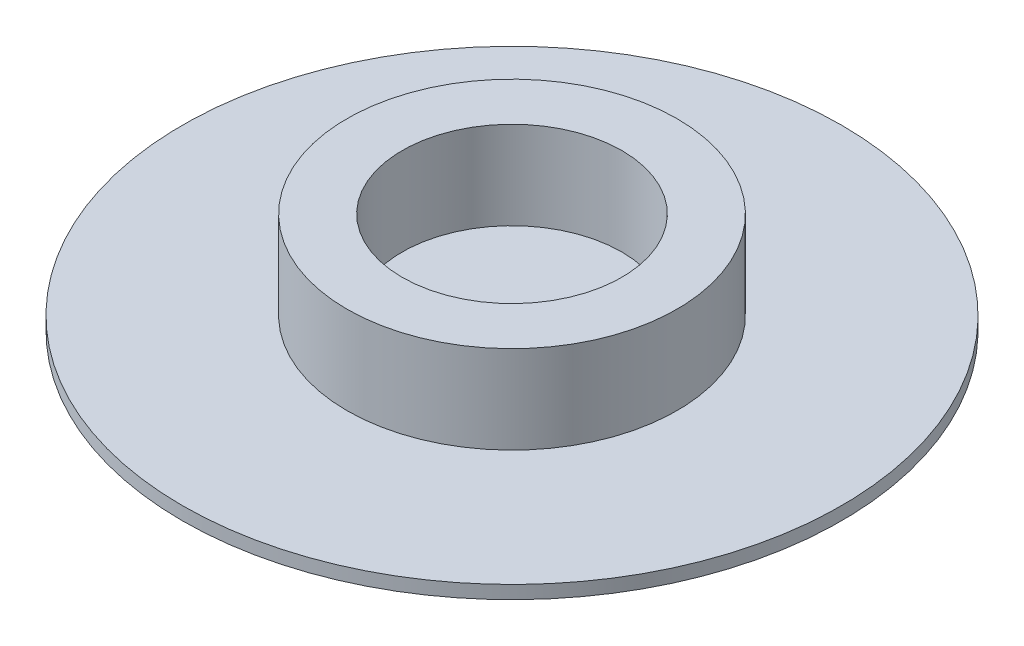
ISO-10303-21;
HEADER;
FILE_DESCRIPTION(('STEP AP214'),'2;1');
FILE_NAME('part.step','',(''),(''),'','','');
FILE_SCHEMA(('AUTOMOTIVE_DESIGN { 1 0 10303 214 1 1 1 1 }'));
ENDSEC;
DATA;
#1=APPLICATION_CONTEXT('core data for automotive mechanical design processes');
#2=APPLICATION_PROTOCOL_DEFINITION('international standard','automotive_design',2000,#1);
#3=PRODUCT_CONTEXT('',#1,'mechanical');
#4=PRODUCT('Part','Part','',(#3));
#5=PRODUCT_RELATED_PRODUCT_CATEGORY('part','',(#4));
#6=PRODUCT_DEFINITION_FORMATION('','',#4);
#7=PRODUCT_DEFINITION_CONTEXT('part definition',#1,'design');
#8=PRODUCT_DEFINITION('design','',#6,#7);
#9=PRODUCT_DEFINITION_SHAPE('','',#8);
#10=(LENGTH_UNIT() NAMED_UNIT(*) SI_UNIT(.MILLI.,.METRE.));
#11=(NAMED_UNIT(*) PLANE_ANGLE_UNIT() SI_UNIT($,.RADIAN.));
#12=(NAMED_UNIT(*) SI_UNIT($,.STERADIAN.) SOLID_ANGLE_UNIT());
#13=UNCERTAINTY_MEASURE_WITH_UNIT(LENGTH_MEASURE(1.E-05),#10,'distance_accuracy_value','');
#14=(GEOMETRIC_REPRESENTATION_CONTEXT(3) GLOBAL_UNCERTAINTY_ASSIGNED_CONTEXT((#13)) GLOBAL_UNIT_ASSIGNED_CONTEXT((#10,
#11,#12)) REPRESENTATION_CONTEXT('',''));
#15=CARTESIAN_POINT('',(0.,0.,0.));
#16=DIRECTION('',(0.,0.,1.));
#17=DIRECTION('',(1.,0.,0.));
#18=AXIS2_PLACEMENT_3D('',#15,#16,#17);
#19=CARTESIAN_POINT('',(0.,3.,0.));
#20=DIRECTION('',(0.,-1.,0.));
#21=DIRECTION('',(0.,0.,-1.));
#22=AXIS2_PLACEMENT_3D('',#19,#20,#21);
#23=CYLINDRICAL_SURFACE('',#22,75.);
#24=CARTESIAN_POINT('',(0.,3.,0.));
#25=DIRECTION('',(0.,1.,0.));
#26=DIRECTION('',(0.,0.,1.));
#27=AXIS2_PLACEMENT_3D('',#24,#25,#26);
#28=CIRCLE('',#27,75.);
#29=CARTESIAN_POINT('',(0.,3.,75.));
#30=VERTEX_POINT('',#29);
#31=EDGE_CURVE('E51',#30,#30,#28,.T.);
#32=ORIENTED_EDGE('',*,*,#31,.F.);
#33=EDGE_LOOP('',(#32));
#34=FACE_BOUND('',#33,.T.);
#35=CARTESIAN_POINT('',(0.,0.,0.));
#36=DIRECTION('',(0.,1.,0.));
#37=DIRECTION('',(0.,0.,1.));
#38=AXIS2_PLACEMENT_3D('',#35,#36,#37);
#39=CIRCLE('',#38,75.);
#40=CARTESIAN_POINT('',(0.,0.,75.));
#41=VERTEX_POINT('',#40);
#42=EDGE_CURVE('E156',#41,#41,#39,.T.);
#43=ORIENTED_EDGE('',*,*,#42,.T.);
#44=EDGE_LOOP('',(#43));
#45=FACE_BOUND('',#44,.T.);
#46=ADVANCED_FACE('F43',(#34,#45),#23,.T.);
#47=CARTESIAN_POINT('',(0.,3.,0.));
#48=DIRECTION('',(0.,1.,0.));
#49=DIRECTION('',(0.,0.,1.));
#50=AXIS2_PLACEMENT_3D('',#47,#48,#49);
#51=PLANE('',#50);
#52=CARTESIAN_POINT('',(0.,3.,0.));
#53=DIRECTION('',(0.,1.,0.));
#54=DIRECTION('',(0.,0.,1.));
#55=AXIS2_PLACEMENT_3D('',#52,#53,#54);
#56=CIRCLE('',#55,37.559343170997);
#57=CARTESIAN_POINT('',(0.,3.,37.559343170997));
#58=VERTEX_POINT('',#57);
#59=EDGE_CURVE('E138',#58,#58,#56,.T.);
#60=ORIENTED_EDGE('',*,*,#59,.F.);
#61=EDGE_LOOP('',(#60));
#62=FACE_BOUND('',#61,.T.);
#63=ORIENTED_EDGE('',*,*,#31,.T.);
#64=EDGE_LOOP('',(#63));
#65=FACE_BOUND('',#64,.T.);
#66=ADVANCED_FACE('F215',(#62,#65),#51,.T.);
#67=CARTESIAN_POINT('',(0.,0.,0.));
#68=DIRECTION('',(0.,1.,0.));
#69=DIRECTION('',(0.,0.,1.));
#70=AXIS2_PLACEMENT_3D('',#67,#68,#69);
#71=PLANE('',#70);
#72=DIRECTION('',(-1.,0.,0.));
#73=VECTOR('',#72,1.);
#74=CARTESIAN_POINT('',(-47.5,0.,25.));
#75=LINE('',#74,#73);
#76=CARTESIAN_POINT('',(-32.5,0.,25.));
#77=VERTEX_POINT('',#76);
#78=CARTESIAN_POINT('',(-47.5,0.,25.));
#79=VERTEX_POINT('',#78);
#80=EDGE_CURVE('E147',#77,#79,#75,.T.);
#81=ORIENTED_EDGE('',*,*,#80,.F.);
#82=DIRECTION('',(0.,0.,1.));
#83=VECTOR('',#82,1.);
#84=CARTESIAN_POINT('',(-32.5,0.,-25.));
#85=LINE('',#84,#83);
#86=CARTESIAN_POINT('',(-32.5,0.,-25.));
#87=VERTEX_POINT('',#86);
#88=EDGE_CURVE('E58',#87,#77,#85,.T.);
#89=ORIENTED_EDGE('',*,*,#88,.F.);
#90=DIRECTION('',(1.,0.,0.));
#91=VECTOR('',#90,1.);
#92=CARTESIAN_POINT('',(-47.5,0.,-25.));
#93=LINE('',#92,#91);
#94=CARTESIAN_POINT('',(-47.5,0.,-25.));
#95=VERTEX_POINT('',#94);
#96=EDGE_CURVE('E131',#95,#87,#93,.T.);
#97=ORIENTED_EDGE('',*,*,#96,.F.);
#98=DIRECTION('',(0.,0.,-1.));
#99=VECTOR('',#98,1.);
#100=CARTESIAN_POINT('',(-47.5,0.,-25.));
#101=LINE('',#100,#99);
#102=EDGE_CURVE('E135',#79,#95,#101,.T.);
#103=ORIENTED_EDGE('',*,*,#102,.F.);
#104=EDGE_LOOP('',(#81,#89,#97,#103));
#105=FACE_BOUND('',#104,.T.);
#106=DIRECTION('',(-1.,0.,0.));
#107=VECTOR('',#106,1.);
#108=CARTESIAN_POINT('',(47.5,0.,25.));
#109=LINE('',#108,#107);
#110=CARTESIAN_POINT('',(47.5,0.,25.));
#111=VERTEX_POINT('',#110);
#112=CARTESIAN_POINT('',(32.5,0.,25.));
#113=VERTEX_POINT('',#112);
#114=EDGE_CURVE('E185',#111,#113,#109,.T.);
#115=ORIENTED_EDGE('',*,*,#114,.F.);
#116=DIRECTION('',(0.,0.,1.));
#117=VECTOR('',#116,1.);
#118=CARTESIAN_POINT('',(47.5,0.,-25.));
#119=LINE('',#118,#117);
#120=CARTESIAN_POINT('',(47.5,0.,-25.));
#121=VERTEX_POINT('',#120);
#122=EDGE_CURVE('E66',#121,#111,#119,.T.);
#123=ORIENTED_EDGE('',*,*,#122,.F.);
#124=DIRECTION('',(1.,0.,0.));
#125=VECTOR('',#124,1.);
#126=CARTESIAN_POINT('',(47.5,0.,-25.));
#127=LINE('',#126,#125);
#128=CARTESIAN_POINT('',(32.5,0.,-25.));
#129=VERTEX_POINT('',#128);
#130=EDGE_CURVE('E176',#129,#121,#127,.T.);
#131=ORIENTED_EDGE('',*,*,#130,.F.);
#132=DIRECTION('',(0.,0.,-1.));
#133=VECTOR('',#132,1.);
#134=CARTESIAN_POINT('',(32.5,0.,-25.));
#135=LINE('',#134,#133);
#136=EDGE_CURVE('E180',#113,#129,#135,.T.);
#137=ORIENTED_EDGE('',*,*,#136,.F.);
#138=EDGE_LOOP('',(#115,#123,#131,#137));
#139=FACE_BOUND('',#138,.T.);
#140=ORIENTED_EDGE('',*,*,#42,.F.);
#141=EDGE_LOOP('',(#140));
#142=FACE_BOUND('',#141,.T.);
#143=ADVANCED_FACE('F212',(#105,#139,#142),#71,.F.);
#144=CARTESIAN_POINT('',(47.5,1.,-25.));
#145=DIRECTION('',(1.,0.,0.));
#146=DIRECTION('',(0.,0.,-1.));
#147=AXIS2_PLACEMENT_3D('',#144,#145,#146);
#148=PLANE('',#147);
#149=ORIENTED_EDGE('',*,*,#122,.T.);
#150=DIRECTION('',(0.,-1.,0.));
#151=VECTOR('',#150,1.);
#152=CARTESIAN_POINT('',(47.5,1.,25.));
#153=LINE('',#152,#151);
#154=CARTESIAN_POINT('',(47.5,1.,25.));
#155=VERTEX_POINT('',#154);
#156=EDGE_CURVE('E162',#155,#111,#153,.T.);
#157=ORIENTED_EDGE('',*,*,#156,.F.);
#158=DIRECTION('',(0.,0.,1.));
#159=VECTOR('',#158,1.);
#160=CARTESIAN_POINT('',(47.5,1.,-25.));
#161=LINE('',#160,#159);
#162=CARTESIAN_POINT('',(47.5,1.,-25.));
#163=VERTEX_POINT('',#162);
#164=EDGE_CURVE('E181',#163,#155,#161,.T.);
#165=ORIENTED_EDGE('',*,*,#164,.F.);
#166=DIRECTION('',(0.,-1.,0.));
#167=VECTOR('',#166,1.);
#168=CARTESIAN_POINT('',(47.5,1.,-25.));
#169=LINE('',#168,#167);
#170=EDGE_CURVE('E172',#163,#121,#169,.T.);
#171=ORIENTED_EDGE('',*,*,#170,.T.);
#172=EDGE_LOOP('',(#149,#157,#165,#171));
#173=FACE_BOUND('',#172,.T.);
#174=ADVANCED_FACE('F214',(#173),#148,.F.);
#175=CARTESIAN_POINT('',(47.5,1.,-25.));
#176=DIRECTION('',(0.,0.,-1.));
#177=DIRECTION('',(-1.,0.,0.));
#178=AXIS2_PLACEMENT_3D('',#175,#176,#177);
#179=PLANE('',#178);
#180=ORIENTED_EDGE('',*,*,#130,.T.);
#181=ORIENTED_EDGE('',*,*,#170,.F.);
#182=DIRECTION('',(1.,0.,0.));
#183=VECTOR('',#182,1.);
#184=CARTESIAN_POINT('',(47.5,1.,-25.));
#185=LINE('',#184,#183);
#186=CARTESIAN_POINT('',(32.5,1.,-25.));
#187=VERTEX_POINT('',#186);
#188=EDGE_CURVE('E165',#187,#163,#185,.T.);
#189=ORIENTED_EDGE('',*,*,#188,.F.);
#190=DIRECTION('',(0.,-1.,0.));
#191=VECTOR('',#190,1.);
#192=CARTESIAN_POINT('',(32.5,1.,-25.));
#193=LINE('',#192,#191);
#194=EDGE_CURVE('E169',#187,#129,#193,.T.);
#195=ORIENTED_EDGE('',*,*,#194,.T.);
#196=EDGE_LOOP('',(#180,#181,#189,#195));
#197=FACE_BOUND('',#196,.T.);
#198=ADVANCED_FACE('F221',(#197),#179,.F.);
#199=CARTESIAN_POINT('',(32.5,1.,-25.));
#200=DIRECTION('',(-1.,0.,0.));
#201=DIRECTION('',(0.,0.,1.));
#202=AXIS2_PLACEMENT_3D('',#199,#200,#201);
#203=PLANE('',#202);
#204=ORIENTED_EDGE('',*,*,#136,.T.);
#205=ORIENTED_EDGE('',*,*,#194,.F.);
#206=DIRECTION('',(0.,0.,-1.));
#207=VECTOR('',#206,1.);
#208=CARTESIAN_POINT('',(32.5,1.,-25.));
#209=LINE('',#208,#207);
#210=CARTESIAN_POINT('',(32.5,1.,25.));
#211=VERTEX_POINT('',#210);
#212=EDGE_CURVE('E194',#211,#187,#209,.T.);
#213=ORIENTED_EDGE('',*,*,#212,.F.);
#214=DIRECTION('',(0.,-1.,0.));
#215=VECTOR('',#214,1.);
#216=CARTESIAN_POINT('',(32.5,1.,25.));
#217=LINE('',#216,#215);
#218=EDGE_CURVE('E166',#211,#113,#217,.T.);
#219=ORIENTED_EDGE('',*,*,#218,.T.);
#220=EDGE_LOOP('',(#204,#205,#213,#219));
#221=FACE_BOUND('',#220,.T.);
#222=ADVANCED_FACE('F350',(#221),#203,.F.);
#223=CARTESIAN_POINT('',(47.5,1.,25.));
#224=DIRECTION('',(0.,0.,1.));
#225=DIRECTION('',(1.,0.,0.));
#226=AXIS2_PLACEMENT_3D('',#223,#224,#225);
#227=PLANE('',#226);
#228=ORIENTED_EDGE('',*,*,#114,.T.);
#229=ORIENTED_EDGE('',*,*,#218,.F.);
#230=DIRECTION('',(-1.,0.,0.));
#231=VECTOR('',#230,1.);
#232=CARTESIAN_POINT('',(47.5,1.,25.));
#233=LINE('',#232,#231);
#234=EDGE_CURVE('E198',#155,#211,#233,.T.);
#235=ORIENTED_EDGE('',*,*,#234,.F.);
#236=ORIENTED_EDGE('',*,*,#156,.T.);
#237=EDGE_LOOP('',(#228,#229,#235,#236));
#238=FACE_BOUND('',#237,.T.);
#239=ADVANCED_FACE('F340',(#238),#227,.F.);
#240=CARTESIAN_POINT('',(0.,1.,0.));
#241=DIRECTION('',(0.,-1.,0.));
#242=DIRECTION('',(0.,0.,-1.));
#243=AXIS2_PLACEMENT_3D('',#240,#241,#242);
#244=PLANE('',#243);
#245=ORIENTED_EDGE('',*,*,#164,.T.);
#246=ORIENTED_EDGE('',*,*,#234,.T.);
#247=ORIENTED_EDGE('',*,*,#212,.T.);
#248=ORIENTED_EDGE('',*,*,#188,.T.);
#249=EDGE_LOOP('',(#245,#246,#247,#248));
#250=FACE_BOUND('',#249,.T.);
#251=ADVANCED_FACE('F331',(#250),#244,.T.);
#252=CARTESIAN_POINT('',(-32.5,1.,-25.));
#253=DIRECTION('',(1.,0.,0.));
#254=DIRECTION('',(0.,0.,-1.));
#255=AXIS2_PLACEMENT_3D('',#252,#253,#254);
#256=PLANE('',#255);
#257=ORIENTED_EDGE('',*,*,#88,.T.);
#258=DIRECTION('',(0.,-1.,0.));
#259=VECTOR('',#258,1.);
#260=CARTESIAN_POINT('',(-32.5,1.,25.));
#261=LINE('',#260,#259);
#262=CARTESIAN_POINT('',(-32.5,1.,25.));
#263=VERTEX_POINT('',#262);
#264=EDGE_CURVE('E106',#263,#77,#261,.T.);
#265=ORIENTED_EDGE('',*,*,#264,.F.);
#266=DIRECTION('',(0.,0.,1.));
#267=VECTOR('',#266,1.);
#268=CARTESIAN_POINT('',(-32.5,1.,-25.));
#269=LINE('',#268,#267);
#270=CARTESIAN_POINT('',(-32.5,1.,-25.));
#271=VERTEX_POINT('',#270);
#272=EDGE_CURVE('E110',#271,#263,#269,.T.);
#273=ORIENTED_EDGE('',*,*,#272,.F.);
#274=DIRECTION('',(0.,-1.,0.));
#275=VECTOR('',#274,1.);
#276=CARTESIAN_POINT('',(-32.5,1.,-25.));
#277=LINE('',#276,#275);
#278=EDGE_CURVE('E153',#271,#87,#277,.T.);
#279=ORIENTED_EDGE('',*,*,#278,.T.);
#280=EDGE_LOOP('',(#257,#265,#273,#279));
#281=FACE_BOUND('',#280,.T.);
#282=ADVANCED_FACE('F108',(#281),#256,.F.);
#283=CARTESIAN_POINT('',(-47.5,1.,-25.));
#284=DIRECTION('',(0.,0.,-1.));
#285=DIRECTION('',(-1.,0.,0.));
#286=AXIS2_PLACEMENT_3D('',#283,#284,#285);
#287=PLANE('',#286);
#288=ORIENTED_EDGE('',*,*,#96,.T.);
#289=ORIENTED_EDGE('',*,*,#278,.F.);
#290=DIRECTION('',(1.,0.,0.));
#291=VECTOR('',#290,1.);
#292=CARTESIAN_POINT('',(-47.5,1.,-25.));
#293=LINE('',#292,#291);
#294=CARTESIAN_POINT('',(-47.5,1.,-25.));
#295=VERTEX_POINT('',#294);
#296=EDGE_CURVE('E117',#295,#271,#293,.T.);
#297=ORIENTED_EDGE('',*,*,#296,.F.);
#298=DIRECTION('',(0.,-1.,0.));
#299=VECTOR('',#298,1.);
#300=CARTESIAN_POINT('',(-47.5,1.,-25.));
#301=LINE('',#300,#299);
#302=EDGE_CURVE('E157',#295,#95,#301,.T.);
#303=ORIENTED_EDGE('',*,*,#302,.T.);
#304=EDGE_LOOP('',(#288,#289,#297,#303));
#305=FACE_BOUND('',#304,.T.);
#306=ADVANCED_FACE('F312',(#305),#287,.F.);
#307=CARTESIAN_POINT('',(-47.5,1.,-25.));
#308=DIRECTION('',(-1.,0.,0.));
#309=DIRECTION('',(0.,0.,1.));
#310=AXIS2_PLACEMENT_3D('',#307,#308,#309);
#311=PLANE('',#310);
#312=ORIENTED_EDGE('',*,*,#102,.T.);
#313=ORIENTED_EDGE('',*,*,#302,.F.);
#314=DIRECTION('',(0.,0.,-1.));
#315=VECTOR('',#314,1.);
#316=CARTESIAN_POINT('',(-47.5,1.,-25.));
#317=LINE('',#316,#315);
#318=CARTESIAN_POINT('',(-47.5,1.,25.));
#319=VERTEX_POINT('',#318);
#320=EDGE_CURVE('E126',#319,#295,#317,.T.);
#321=ORIENTED_EDGE('',*,*,#320,.F.);
#322=DIRECTION('',(0.,-1.,0.));
#323=VECTOR('',#322,1.);
#324=CARTESIAN_POINT('',(-47.5,1.,25.));
#325=LINE('',#324,#323);
#326=EDGE_CURVE('E116',#319,#79,#325,.T.);
#327=ORIENTED_EDGE('',*,*,#326,.T.);
#328=EDGE_LOOP('',(#312,#313,#321,#327));
#329=FACE_BOUND('',#328,.T.);
#330=ADVANCED_FACE('F304',(#329),#311,.F.);
#331=CARTESIAN_POINT('',(-47.5,1.,25.));
#332=DIRECTION('',(0.,0.,1.));
#333=DIRECTION('',(1.,0.,0.));
#334=AXIS2_PLACEMENT_3D('',#331,#332,#333);
#335=PLANE('',#334);
#336=ORIENTED_EDGE('',*,*,#80,.T.);
#337=ORIENTED_EDGE('',*,*,#326,.F.);
#338=DIRECTION('',(-1.,0.,0.));
#339=VECTOR('',#338,1.);
#340=CARTESIAN_POINT('',(-47.5,1.,25.));
#341=LINE('',#340,#339);
#342=EDGE_CURVE('E120',#263,#319,#341,.T.);
#343=ORIENTED_EDGE('',*,*,#342,.F.);
#344=ORIENTED_EDGE('',*,*,#264,.T.);
#345=EDGE_LOOP('',(#336,#337,#343,#344));
#346=FACE_BOUND('',#345,.T.);
#347=ADVANCED_FACE('F121',(#346),#335,.F.);
#348=CARTESIAN_POINT('',(0.,1.,0.));
#349=DIRECTION('',(0.,1.,0.));
#350=DIRECTION('',(0.,0.,1.));
#351=AXIS2_PLACEMENT_3D('',#348,#349,#350);
#352=PLANE('',#351);
#353=ORIENTED_EDGE('',*,*,#272,.T.);
#354=ORIENTED_EDGE('',*,*,#342,.T.);
#355=ORIENTED_EDGE('',*,*,#320,.T.);
#356=ORIENTED_EDGE('',*,*,#296,.T.);
#357=EDGE_LOOP('',(#353,#354,#355,#356));
#358=FACE_BOUND('',#357,.T.);
#359=ADVANCED_FACE('F128',(#358),#352,.F.);
#360=CARTESIAN_POINT('',(0.,23.,0.));
#361=DIRECTION('',(0.,1.,0.));
#362=DIRECTION('',(0.,0.,1.));
#363=AXIS2_PLACEMENT_3D('',#360,#361,#362);
#364=PLANE('',#363);
#365=CARTESIAN_POINT('',(0.,23.,0.));
#366=DIRECTION('',(0.,1.,0.));
#367=DIRECTION('',(0.,0.,1.));
#368=AXIS2_PLACEMENT_3D('',#365,#366,#367);
#369=CIRCLE('',#368,37.559343170997);
#370=CARTESIAN_POINT('',(0.,23.,37.559343170997));
#371=VERTEX_POINT('',#370);
#372=EDGE_CURVE('E175',#371,#371,#369,.T.);
#373=ORIENTED_EDGE('',*,*,#372,.T.);
#374=EDGE_LOOP('',(#373));
#375=FACE_BOUND('',#374,.T.);
#376=CARTESIAN_POINT('',(0.,23.,0.));
#377=DIRECTION('',(0.,1.,0.));
#378=DIRECTION('',(0.,0.,1.));
#379=AXIS2_PLACEMENT_3D('',#376,#377,#378);
#380=CIRCLE('',#379,25.);
#381=CARTESIAN_POINT('',(0.,23.,25.));
#382=VERTEX_POINT('',#381);
#383=EDGE_CURVE('E421',#382,#382,#380,.T.);
#384=ORIENTED_EDGE('',*,*,#383,.F.);
#385=EDGE_LOOP('',(#384));
#386=FACE_BOUND('',#385,.T.);
#387=ADVANCED_FACE('F249',(#375,#386),#364,.T.);
#388=CARTESIAN_POINT('',(0.,23.,0.));
#389=DIRECTION('',(0.,-1.,0.));
#390=DIRECTION('',(0.,0.,-1.));
#391=AXIS2_PLACEMENT_3D('',#388,#389,#390);
#392=CYLINDRICAL_SURFACE('',#391,37.559343170997);
#393=ORIENTED_EDGE('',*,*,#372,.F.);
#394=EDGE_LOOP('',(#393));
#395=FACE_BOUND('',#394,.T.);
#396=ORIENTED_EDGE('',*,*,#59,.T.);
#397=EDGE_LOOP('',(#396));
#398=FACE_BOUND('',#397,.T.);
#399=ADVANCED_FACE('F254',(#395,#398),#392,.T.);
#400=CARTESIAN_POINT('',(0.,23.,0.));
#401=DIRECTION('',(0.,-1.,0.));
#402=DIRECTION('',(0.,0.,-1.));
#403=AXIS2_PLACEMENT_3D('',#400,#401,#402);
#404=CYLINDRICAL_SURFACE('',#403,25.);
#405=ORIENTED_EDGE('',*,*,#383,.T.);
#406=EDGE_LOOP('',(#405));
#407=FACE_BOUND('',#406,.T.);
#408=CARTESIAN_POINT('',(0.,3.,0.));
#409=DIRECTION('',(0.,1.,0.));
#410=DIRECTION('',(0.,0.,1.));
#411=AXIS2_PLACEMENT_3D('',#408,#409,#410);
#412=CIRCLE('',#411,25.);
#413=CARTESIAN_POINT('',(0.,3.,25.));
#414=VERTEX_POINT('',#413);
#415=EDGE_CURVE('E11',#414,#414,#412,.F.);
#416=ORIENTED_EDGE('',*,*,#415,.T.);
#417=EDGE_LOOP('',(#416));
#418=FACE_BOUND('',#417,.T.);
#419=ADVANCED_FACE('F266',(#407,#418),#404,.F.);
#420=ORIENTED_EDGE('',*,*,#415,.F.);
#421=EDGE_LOOP('',(#420));
#422=FACE_BOUND('',#421,.T.);
#423=ADVANCED_FACE('F225',(#422),#51,.T.);
#424=CLOSED_SHELL('',(#46,#66,#143,#174,#198,#222,#239,#251,#282,#306,#330,#347,#359,#387,#399,
#419,#423));
#425=MANIFOLD_SOLID_BREP('B2',#424);
#426=ADVANCED_BREP_SHAPE_REPRESENTATION('',(#18,#425),#14);
#427=SHAPE_DEFINITION_REPRESENTATION(#9,#426);
ENDSEC;
END-ISO-10303-21;
